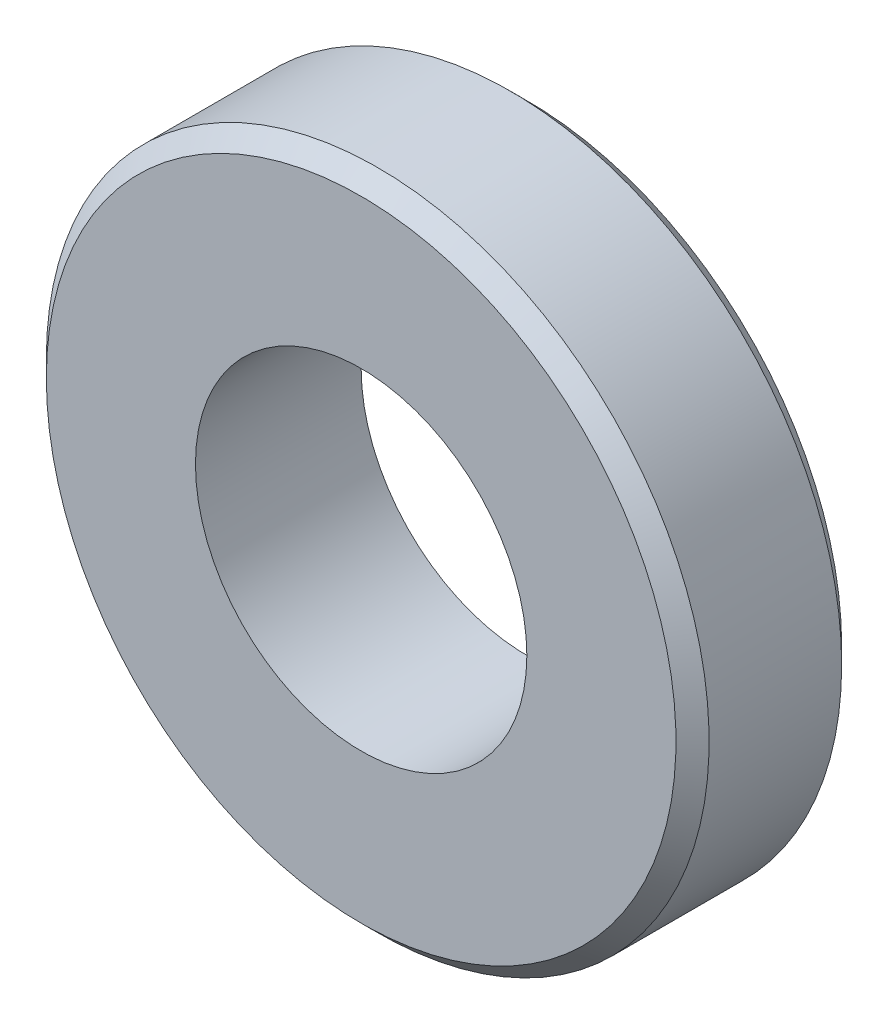
ISO-10303-21;
HEADER;
FILE_DESCRIPTION(('STEP AP214'),'2;1');
FILE_NAME('part.step','',(''),(''),'','','');
FILE_SCHEMA(('AUTOMOTIVE_DESIGN { 1 0 10303 214 1 1 1 1 }'));
ENDSEC;
DATA;
#1=APPLICATION_CONTEXT('core data for automotive mechanical design processes');
#2=APPLICATION_PROTOCOL_DEFINITION('international standard','automotive_design',2000,#1);
#3=PRODUCT_CONTEXT('',#1,'mechanical');
#4=PRODUCT('Part','Part','',(#3));
#5=PRODUCT_RELATED_PRODUCT_CATEGORY('part','',(#4));
#6=PRODUCT_DEFINITION_FORMATION('','',#4);
#7=PRODUCT_DEFINITION_CONTEXT('part definition',#1,'design');
#8=PRODUCT_DEFINITION('design','',#6,#7);
#9=PRODUCT_DEFINITION_SHAPE('','',#8);
#10=(LENGTH_UNIT() NAMED_UNIT(*) SI_UNIT(.MILLI.,.METRE.));
#11=(NAMED_UNIT(*) PLANE_ANGLE_UNIT() SI_UNIT($,.RADIAN.));
#12=(NAMED_UNIT(*) SI_UNIT($,.STERADIAN.) SOLID_ANGLE_UNIT());
#13=UNCERTAINTY_MEASURE_WITH_UNIT(LENGTH_MEASURE(1.E-05),#10,'distance_accuracy_value','');
#14=(GEOMETRIC_REPRESENTATION_CONTEXT(3) GLOBAL_UNCERTAINTY_ASSIGNED_CONTEXT((#13)) GLOBAL_UNIT_ASSIGNED_CONTEXT((#10,
#11,#12)) REPRESENTATION_CONTEXT('',''));
#15=CARTESIAN_POINT('',(0.,0.,0.));
#16=DIRECTION('',(0.,0.,1.));
#17=DIRECTION('',(1.,0.,0.));
#18=AXIS2_PLACEMENT_3D('',#15,#16,#17);
#19=CARTESIAN_POINT('',(0.,0.,0.));
#20=DIRECTION('',(0.,0.,-1.));
#21=DIRECTION('',(-1.,0.,0.));
#22=AXIS2_PLACEMENT_3D('',#19,#20,#21);
#23=CYLINDRICAL_SURFACE('',#22,10.);
#24=CARTESIAN_POINT('',(0.,0.,5.));
#25=DIRECTION('',(0.,0.,-1.));
#26=DIRECTION('',(-1.,0.,0.));
#27=AXIS2_PLACEMENT_3D('',#24,#25,#26);
#28=CIRCLE('',#27,10.);
#29=CARTESIAN_POINT('',(-10.,0.,5.));
#30=VERTEX_POINT('',#29);
#31=EDGE_CURVE('E81',#30,#30,#28,.T.);
#32=ORIENTED_EDGE('',*,*,#31,.F.);
#33=EDGE_LOOP('',(#32));
#34=FACE_BOUND('',#33,.T.);
#35=CARTESIAN_POINT('',(0.,0.,-5.));
#36=DIRECTION('',(0.,0.,-1.));
#37=DIRECTION('',(-1.,0.,0.));
#38=AXIS2_PLACEMENT_3D('',#35,#36,#37);
#39=CIRCLE('',#38,10.);
#40=CARTESIAN_POINT('',(-10.,0.,-5.));
#41=VERTEX_POINT('',#40);
#42=EDGE_CURVE('E77',#41,#41,#39,.T.);
#43=ORIENTED_EDGE('',*,*,#42,.T.);
#44=EDGE_LOOP('',(#43));
#45=FACE_BOUND('',#44,.T.);
#46=ADVANCED_FACE('F51',(#34,#45),#23,.F.);
#47=CARTESIAN_POINT('',(10.,0.,-5.));
#48=DIRECTION('',(0.,0.,1.));
#49=DIRECTION('',(1.,0.,0.));
#50=AXIS2_PLACEMENT_3D('',#47,#48,#49);
#51=PLANE('',#50);
#52=CARTESIAN_POINT('',(0.,0.,-5.));
#53=DIRECTION('',(0.,0.,1.));
#54=DIRECTION('',(1.,0.,0.));
#55=AXIS2_PLACEMENT_3D('',#52,#53,#54);
#56=CIRCLE('',#55,19.);
#57=CARTESIAN_POINT('',(19.,0.,-5.));
#58=VERTEX_POINT('',#57);
#59=EDGE_CURVE('E71',#58,#58,#56,.F.);
#60=ORIENTED_EDGE('',*,*,#59,.T.);
#61=EDGE_LOOP('',(#60));
#62=FACE_BOUND('',#61,.T.);
#63=ORIENTED_EDGE('',*,*,#42,.F.);
#64=EDGE_LOOP('',(#63));
#65=FACE_BOUND('',#64,.T.);
#66=ADVANCED_FACE('F89',(#62,#65),#51,.F.);
#67=CARTESIAN_POINT('',(0.,0.,0.));
#68=DIRECTION('',(0.,0.,-1.));
#69=DIRECTION('',(-1.,0.,0.));
#70=AXIS2_PLACEMENT_3D('',#67,#68,#69);
#71=CYLINDRICAL_SURFACE('',#70,20.);
#72=CARTESIAN_POINT('',(0.,0.,-4.00000000000001));
#73=DIRECTION('',(0.,0.,1.));
#74=DIRECTION('',(1.,0.,0.));
#75=AXIS2_PLACEMENT_3D('',#72,#73,#74);
#76=CIRCLE('',#75,20.);
#77=CARTESIAN_POINT('',(20.,0.,-4.00000000000001));
#78=VERTEX_POINT('',#77);
#79=EDGE_CURVE('E60',#78,#78,#76,.T.);
#80=ORIENTED_EDGE('',*,*,#79,.T.);
#81=EDGE_LOOP('',(#80));
#82=FACE_BOUND('',#81,.T.);
#83=CARTESIAN_POINT('',(0.,0.,4.00000000000001));
#84=DIRECTION('',(0.,0.,-1.));
#85=DIRECTION('',(-1.,0.,0.));
#86=AXIS2_PLACEMENT_3D('',#83,#84,#85);
#87=CIRCLE('',#86,20.);
#88=CARTESIAN_POINT('',(-20.,0.,4.00000000000001));
#89=VERTEX_POINT('',#88);
#90=EDGE_CURVE('E66',#89,#89,#87,.T.);
#91=ORIENTED_EDGE('',*,*,#90,.T.);
#92=EDGE_LOOP('',(#91));
#93=FACE_BOUND('',#92,.T.);
#94=ADVANCED_FACE('F94',(#82,#93),#71,.T.);
#95=CARTESIAN_POINT('',(20.,0.,5.));
#96=DIRECTION('',(0.,0.,-1.));
#97=DIRECTION('',(-1.,0.,0.));
#98=AXIS2_PLACEMENT_3D('',#95,#96,#97);
#99=PLANE('',#98);
#100=CARTESIAN_POINT('',(0.,0.,5.));
#101=DIRECTION('',(0.,0.,-1.));
#102=DIRECTION('',(-1.,0.,0.));
#103=AXIS2_PLACEMENT_3D('',#100,#101,#102);
#104=CIRCLE('',#103,19.);
#105=CARTESIAN_POINT('',(-19.,0.,5.));
#106=VERTEX_POINT('',#105);
#107=EDGE_CURVE('E10',#106,#106,#104,.F.);
#108=ORIENTED_EDGE('',*,*,#107,.T.);
#109=EDGE_LOOP('',(#108));
#110=FACE_BOUND('',#109,.T.);
#111=ORIENTED_EDGE('',*,*,#31,.T.);
#112=EDGE_LOOP('',(#111));
#113=FACE_BOUND('',#112,.T.);
#114=ADVANCED_FACE('F85',(#110,#113),#99,.F.);
#115=CARTESIAN_POINT('',(0.,0.,-5.));
#116=DIRECTION('',(0.,0.,1.));
#117=DIRECTION('',(1.,0.,0.));
#118=AXIS2_PLACEMENT_3D('',#115,#116,#117);
#119=CONICAL_SURFACE('',#118,19.,0.785398163397448);
#120=ORIENTED_EDGE('',*,*,#79,.F.);
#121=EDGE_LOOP('',(#120));
#122=FACE_BOUND('',#121,.T.);
#123=ORIENTED_EDGE('',*,*,#59,.F.);
#124=EDGE_LOOP('',(#123));
#125=FACE_BOUND('',#124,.T.);
#126=ADVANCED_FACE('F105',(#122,#125),#119,.T.);
#127=CARTESIAN_POINT('',(0.,0.,4.00000000000001));
#128=DIRECTION('',(0.,0.,-1.));
#129=DIRECTION('',(-1.,0.,0.));
#130=AXIS2_PLACEMENT_3D('',#127,#128,#129);
#131=CONICAL_SURFACE('',#130,20.,0.785398163397453);
#132=ORIENTED_EDGE('',*,*,#107,.F.);
#133=EDGE_LOOP('',(#132));
#134=FACE_BOUND('',#133,.T.);
#135=ORIENTED_EDGE('',*,*,#90,.F.);
#136=EDGE_LOOP('',(#135));
#137=FACE_BOUND('',#136,.T.);
#138=ADVANCED_FACE('F54',(#134,#137),#131,.T.);
#139=CLOSED_SHELL('',(#46,#66,#94,#114,#126,#138));
#140=MANIFOLD_SOLID_BREP('B2',#139);
#141=ADVANCED_BREP_SHAPE_REPRESENTATION('',(#18,#140),#14);
#142=SHAPE_DEFINITION_REPRESENTATION(#9,#141);
ENDSEC;
END-ISO-10303-21;
